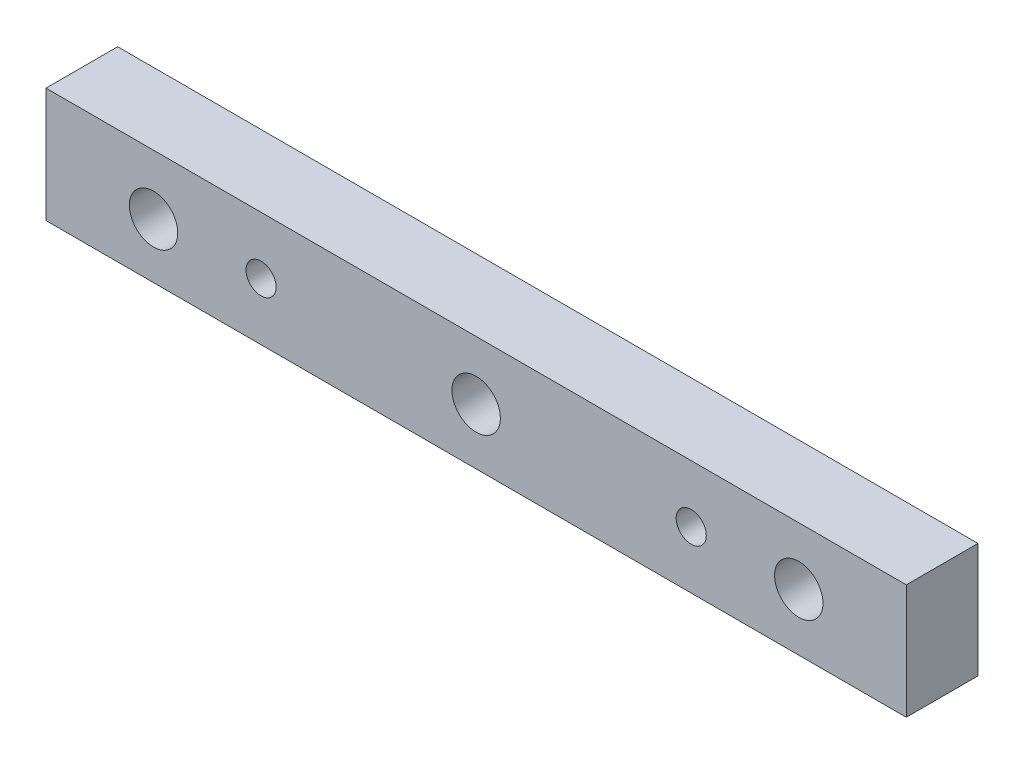
ISO-10303-21;
HEADER;
FILE_DESCRIPTION(('STEP AP214'),'2;1');
FILE_NAME('part.step','',(''),(''),'','','');
FILE_SCHEMA(('AUTOMOTIVE_DESIGN { 1 0 10303 214 1 1 1 1 }'));
ENDSEC;
DATA;
#1=APPLICATION_CONTEXT('core data for automotive mechanical design processes');
#2=APPLICATION_PROTOCOL_DEFINITION('international standard','automotive_design',2000,#1);
#3=PRODUCT_CONTEXT('',#1,'mechanical');
#4=PRODUCT('Part','Part','',(#3));
#5=PRODUCT_RELATED_PRODUCT_CATEGORY('part','',(#4));
#6=PRODUCT_DEFINITION_FORMATION('','',#4);
#7=PRODUCT_DEFINITION_CONTEXT('part definition',#1,'design');
#8=PRODUCT_DEFINITION('design','',#6,#7);
#9=PRODUCT_DEFINITION_SHAPE('','',#8);
#10=(LENGTH_UNIT() NAMED_UNIT(*) SI_UNIT(.MILLI.,.METRE.));
#11=(NAMED_UNIT(*) PLANE_ANGLE_UNIT() SI_UNIT($,.RADIAN.));
#12=(NAMED_UNIT(*) SI_UNIT($,.STERADIAN.) SOLID_ANGLE_UNIT());
#13=UNCERTAINTY_MEASURE_WITH_UNIT(LENGTH_MEASURE(1.E-05),#10,'distance_accuracy_value','');
#14=(GEOMETRIC_REPRESENTATION_CONTEXT(3) GLOBAL_UNCERTAINTY_ASSIGNED_CONTEXT((#13)) GLOBAL_UNIT_ASSIGNED_CONTEXT((#10,
#11,#12)) REPRESENTATION_CONTEXT('',''));
#15=CARTESIAN_POINT('',(0.,0.,0.));
#16=DIRECTION('',(0.,0.,1.));
#17=DIRECTION('',(1.,0.,0.));
#18=AXIS2_PLACEMENT_3D('',#15,#16,#17);
#19=CARTESIAN_POINT('',(-39.4695723684211,11.875,10.));
#20=DIRECTION('',(1.,0.,0.));
#21=DIRECTION('',(0.,0.,-1.));
#22=AXIS2_PLACEMENT_3D('',#19,#20,#21);
#23=PLANE('',#22);
#24=DIRECTION('',(0.,-1.,0.));
#25=VECTOR('',#24,1.);
#26=CARTESIAN_POINT('',(-39.4695723684211,11.875,0.));
#27=LINE('',#26,#25);
#28=CARTESIAN_POINT('',(-39.4695723684211,11.875,0.));
#29=VERTEX_POINT('',#28);
#30=CARTESIAN_POINT('',(-39.4695723684211,-4.125,0.));
#31=VERTEX_POINT('',#30);
#32=EDGE_CURVE('E101',#29,#31,#27,.T.);
#33=ORIENTED_EDGE('',*,*,#32,.T.);
#34=DIRECTION('',(0.,0.,-1.));
#35=VECTOR('',#34,1.);
#36=CARTESIAN_POINT('',(-39.4695723684211,-4.125,10.));
#37=LINE('',#36,#35);
#38=CARTESIAN_POINT('',(-39.4695723684211,-4.125,10.));
#39=VERTEX_POINT('',#38);
#40=EDGE_CURVE('E11',#39,#31,#37,.T.);
#41=ORIENTED_EDGE('',*,*,#40,.F.);
#42=DIRECTION('',(0.,-1.,0.));
#43=VECTOR('',#42,1.);
#44=CARTESIAN_POINT('',(-39.4695723684211,11.875,10.));
#45=LINE('',#44,#43);
#46=CARTESIAN_POINT('',(-39.4695723684211,11.875,10.));
#47=VERTEX_POINT('',#46);
#48=EDGE_CURVE('E89',#47,#39,#45,.T.);
#49=ORIENTED_EDGE('',*,*,#48,.F.);
#50=DIRECTION('',(0.,0.,-1.));
#51=VECTOR('',#50,1.);
#52=CARTESIAN_POINT('',(-39.4695723684211,11.875,10.));
#53=LINE('',#52,#51);
#54=EDGE_CURVE('E97',#47,#29,#53,.T.);
#55=ORIENTED_EDGE('',*,*,#54,.T.);
#56=EDGE_LOOP('',(#33,#41,#49,#55));
#57=FACE_BOUND('',#56,.T.);
#58=ADVANCED_FACE('F38',(#57),#23,.F.);
#59=CARTESIAN_POINT('',(-39.4695723684211,-4.125,10.));
#60=DIRECTION('',(0.,1.,0.));
#61=DIRECTION('',(0.,0.,1.));
#62=AXIS2_PLACEMENT_3D('',#59,#60,#61);
#63=PLANE('',#62);
#64=DIRECTION('',(1.,0.,0.));
#65=VECTOR('',#64,1.);
#66=CARTESIAN_POINT('',(-39.4695723684211,-4.125,0.));
#67=LINE('',#66,#65);
#68=CARTESIAN_POINT('',(80.5304276315789,-4.125,0.));
#69=VERTEX_POINT('',#68);
#70=EDGE_CURVE('E93',#31,#69,#67,.T.);
#71=ORIENTED_EDGE('',*,*,#70,.T.);
#72=DIRECTION('',(0.,0.,-1.));
#73=VECTOR('',#72,1.);
#74=CARTESIAN_POINT('',(80.5304276315789,-4.125,10.));
#75=LINE('',#74,#73);
#76=CARTESIAN_POINT('',(80.5304276315789,-4.125,10.));
#77=VERTEX_POINT('',#76);
#78=EDGE_CURVE('E46',#77,#69,#75,.T.);
#79=ORIENTED_EDGE('',*,*,#78,.F.);
#80=DIRECTION('',(1.,0.,0.));
#81=VECTOR('',#80,1.);
#82=CARTESIAN_POINT('',(-39.4695723684211,-4.125,10.));
#83=LINE('',#82,#81);
#84=EDGE_CURVE('E84',#39,#77,#83,.T.);
#85=ORIENTED_EDGE('',*,*,#84,.F.);
#86=ORIENTED_EDGE('',*,*,#40,.T.);
#87=EDGE_LOOP('',(#71,#79,#85,#86));
#88=FACE_BOUND('',#87,.T.);
#89=ADVANCED_FACE('F92',(#88),#63,.F.);
#90=CARTESIAN_POINT('',(80.5304276315789,11.875,10.));
#91=DIRECTION('',(-1.,0.,0.));
#92=DIRECTION('',(0.,0.,1.));
#93=AXIS2_PLACEMENT_3D('',#90,#91,#92);
#94=PLANE('',#93);
#95=DIRECTION('',(0.,1.,0.));
#96=VECTOR('',#95,1.);
#97=CARTESIAN_POINT('',(80.5304276315789,11.875,0.));
#98=LINE('',#97,#96);
#99=CARTESIAN_POINT('',(80.5304276315789,11.875,0.));
#100=VERTEX_POINT('',#99);
#101=EDGE_CURVE('E71',#69,#100,#98,.T.);
#102=ORIENTED_EDGE('',*,*,#101,.T.);
#103=DIRECTION('',(0.,0.,-1.));
#104=VECTOR('',#103,1.);
#105=CARTESIAN_POINT('',(80.5304276315789,11.875,10.));
#106=LINE('',#105,#104);
#107=CARTESIAN_POINT('',(80.5304276315789,11.875,10.));
#108=VERTEX_POINT('',#107);
#109=EDGE_CURVE('E94',#108,#100,#106,.T.);
#110=ORIENTED_EDGE('',*,*,#109,.F.);
#111=DIRECTION('',(0.,1.,0.));
#112=VECTOR('',#111,1.);
#113=CARTESIAN_POINT('',(80.5304276315789,11.875,10.));
#114=LINE('',#113,#112);
#115=EDGE_CURVE('E87',#77,#108,#114,.T.);
#116=ORIENTED_EDGE('',*,*,#115,.F.);
#117=ORIENTED_EDGE('',*,*,#78,.T.);
#118=EDGE_LOOP('',(#102,#110,#116,#117));
#119=FACE_BOUND('',#118,.T.);
#120=ADVANCED_FACE('F95',(#119),#94,.F.);
#121=CARTESIAN_POINT('',(-39.4695723684211,11.875,10.));
#122=DIRECTION('',(0.,-1.,0.));
#123=DIRECTION('',(0.,0.,-1.));
#124=AXIS2_PLACEMENT_3D('',#121,#122,#123);
#125=PLANE('',#124);
#126=DIRECTION('',(-1.,0.,0.));
#127=VECTOR('',#126,1.);
#128=CARTESIAN_POINT('',(-39.4695723684211,11.875,0.));
#129=LINE('',#128,#127);
#130=EDGE_CURVE('E77',#100,#29,#129,.T.);
#131=ORIENTED_EDGE('',*,*,#130,.T.);
#132=ORIENTED_EDGE('',*,*,#54,.F.);
#133=DIRECTION('',(-1.,0.,0.));
#134=VECTOR('',#133,1.);
#135=CARTESIAN_POINT('',(-39.4695723684211,11.875,10.));
#136=LINE('',#135,#134);
#137=EDGE_CURVE('E54',#108,#47,#136,.T.);
#138=ORIENTED_EDGE('',*,*,#137,.F.);
#139=ORIENTED_EDGE('',*,*,#109,.T.);
#140=EDGE_LOOP('',(#131,#132,#138,#139));
#141=FACE_BOUND('',#140,.T.);
#142=ADVANCED_FACE('F109',(#141),#125,.F.);
#143=CARTESIAN_POINT('',(0.,0.,10.));
#144=DIRECTION('',(0.,0.,1.));
#145=DIRECTION('',(1.,0.,0.));
#146=AXIS2_PLACEMENT_3D('',#143,#144,#145);
#147=PLANE('',#146);
#148=CARTESIAN_POINT('',(-24.4695723684211,3.55401842519762,10.));
#149=DIRECTION('',(0.,0.,1.));
#150=DIRECTION('',(1.,0.,0.));
#151=AXIS2_PLACEMENT_3D('',#148,#149,#150);
#152=CIRCLE('',#151,3.3782);
#153=CARTESIAN_POINT('',(-21.0913723684211,3.55401842519762,10.));
#154=VERTEX_POINT('',#153);
#155=EDGE_CURVE('E141',#154,#154,#152,.T.);
#156=ORIENTED_EDGE('',*,*,#155,.F.);
#157=EDGE_LOOP('',(#156));
#158=FACE_BOUND('',#157,.T.);
#159=CARTESIAN_POINT('',(20.5304276315789,3.69158195725579,10.));
#160=DIRECTION('',(0.,0.,1.));
#161=DIRECTION('',(1.,0.,0.));
#162=AXIS2_PLACEMENT_3D('',#159,#160,#161);
#163=CIRCLE('',#162,3.3782);
#164=CARTESIAN_POINT('',(23.9086276315789,3.69158195725579,10.));
#165=VERTEX_POINT('',#164);
#166=EDGE_CURVE('E135',#165,#165,#163,.T.);
#167=ORIENTED_EDGE('',*,*,#166,.F.);
#168=EDGE_LOOP('',(#167));
#169=FACE_BOUND('',#168,.T.);
#170=CARTESIAN_POINT('',(65.5304276315789,3.82914548931395,10.));
#171=DIRECTION('',(0.,0.,1.));
#172=DIRECTION('',(1.,0.,0.));
#173=AXIS2_PLACEMENT_3D('',#170,#171,#172);
#174=CIRCLE('',#173,3.3782);
#175=CARTESIAN_POINT('',(68.9086276315789,3.82914548931395,10.));
#176=VERTEX_POINT('',#175);
#177=EDGE_CURVE('E129',#176,#176,#174,.T.);
#178=ORIENTED_EDGE('',*,*,#177,.F.);
#179=EDGE_LOOP('',(#178));
#180=FACE_BOUND('',#179,.T.);
#181=CARTESIAN_POINT('',(-9.46957236842105,3.87499999999999,10.));
#182=DIRECTION('',(0.,0.,1.));
#183=DIRECTION('',(1.,0.,0.));
#184=AXIS2_PLACEMENT_3D('',#181,#182,#183);
#185=CIRCLE('',#184,2.1);
#186=CARTESIAN_POINT('',(-7.36957236842105,3.87499999999999,10.));
#187=VERTEX_POINT('',#186);
#188=EDGE_CURVE('E123',#187,#187,#185,.T.);
#189=ORIENTED_EDGE('',*,*,#188,.F.);
#190=EDGE_LOOP('',(#189));
#191=FACE_BOUND('',#190,.T.);
#192=CARTESIAN_POINT('',(50.5304276315789,3.87499999999999,10.));
#193=DIRECTION('',(0.,0.,1.));
#194=DIRECTION('',(1.,0.,0.));
#195=AXIS2_PLACEMENT_3D('',#192,#193,#194);
#196=CIRCLE('',#195,2.1);
#197=CARTESIAN_POINT('',(52.6304276315789,3.87499999999999,10.));
#198=VERTEX_POINT('',#197);
#199=EDGE_CURVE('E117',#198,#198,#196,.T.);
#200=ORIENTED_EDGE('',*,*,#199,.F.);
#201=EDGE_LOOP('',(#200));
#202=FACE_BOUND('',#201,.T.);
#203=ORIENTED_EDGE('',*,*,#48,.T.);
#204=ORIENTED_EDGE('',*,*,#84,.T.);
#205=ORIENTED_EDGE('',*,*,#115,.T.);
#206=ORIENTED_EDGE('',*,*,#137,.T.);
#207=EDGE_LOOP('',(#203,#204,#205,#206));
#208=FACE_BOUND('',#207,.T.);
#209=ADVANCED_FACE('F85',(#158,#169,#180,#191,#202,#208),#147,.T.);
#210=CARTESIAN_POINT('',(0.,0.,0.));
#211=DIRECTION('',(0.,0.,1.));
#212=DIRECTION('',(1.,0.,0.));
#213=AXIS2_PLACEMENT_3D('',#210,#211,#212);
#214=PLANE('',#213);
#215=CARTESIAN_POINT('',(-24.4695723684211,3.55401842519762,0.));
#216=DIRECTION('',(0.,0.,1.));
#217=DIRECTION('',(1.,0.,0.));
#218=AXIS2_PLACEMENT_3D('',#215,#216,#217);
#219=CIRCLE('',#218,3.3782);
#220=CARTESIAN_POINT('',(-21.0913723684211,3.55401842519762,0.));
#221=VERTEX_POINT('',#220);
#222=EDGE_CURVE('E138',#221,#221,#219,.T.);
#223=ORIENTED_EDGE('',*,*,#222,.T.);
#224=EDGE_LOOP('',(#223));
#225=FACE_BOUND('',#224,.T.);
#226=CARTESIAN_POINT('',(20.5304276315789,3.69158195725579,0.));
#227=DIRECTION('',(0.,0.,1.));
#228=DIRECTION('',(1.,0.,0.));
#229=AXIS2_PLACEMENT_3D('',#226,#227,#228);
#230=CIRCLE('',#229,3.3782);
#231=CARTESIAN_POINT('',(23.9086276315789,3.69158195725579,0.));
#232=VERTEX_POINT('',#231);
#233=EDGE_CURVE('E132',#232,#232,#230,.T.);
#234=ORIENTED_EDGE('',*,*,#233,.T.);
#235=EDGE_LOOP('',(#234));
#236=FACE_BOUND('',#235,.T.);
#237=CARTESIAN_POINT('',(65.5304276315789,3.82914548931395,0.));
#238=DIRECTION('',(0.,0.,1.));
#239=DIRECTION('',(1.,0.,0.));
#240=AXIS2_PLACEMENT_3D('',#237,#238,#239);
#241=CIRCLE('',#240,3.3782);
#242=CARTESIAN_POINT('',(68.9086276315789,3.82914548931395,0.));
#243=VERTEX_POINT('',#242);
#244=EDGE_CURVE('E126',#243,#243,#241,.T.);
#245=ORIENTED_EDGE('',*,*,#244,.T.);
#246=EDGE_LOOP('',(#245));
#247=FACE_BOUND('',#246,.T.);
#248=CARTESIAN_POINT('',(-9.46957236842105,3.87499999999999,0.));
#249=DIRECTION('',(0.,0.,1.));
#250=DIRECTION('',(1.,0.,0.));
#251=AXIS2_PLACEMENT_3D('',#248,#249,#250);
#252=CIRCLE('',#251,2.1);
#253=CARTESIAN_POINT('',(-7.36957236842105,3.87499999999999,0.));
#254=VERTEX_POINT('',#253);
#255=EDGE_CURVE('E120',#254,#254,#252,.T.);
#256=ORIENTED_EDGE('',*,*,#255,.T.);
#257=EDGE_LOOP('',(#256));
#258=FACE_BOUND('',#257,.T.);
#259=CARTESIAN_POINT('',(50.5304276315789,3.87499999999999,0.));
#260=DIRECTION('',(0.,0.,1.));
#261=DIRECTION('',(1.,0.,0.));
#262=AXIS2_PLACEMENT_3D('',#259,#260,#261);
#263=CIRCLE('',#262,2.1);
#264=CARTESIAN_POINT('',(52.6304276315789,3.87499999999999,0.));
#265=VERTEX_POINT('',#264);
#266=EDGE_CURVE('E104',#265,#265,#263,.T.);
#267=ORIENTED_EDGE('',*,*,#266,.T.);
#268=EDGE_LOOP('',(#267));
#269=FACE_BOUND('',#268,.T.);
#270=ORIENTED_EDGE('',*,*,#32,.F.);
#271=ORIENTED_EDGE('',*,*,#130,.F.);
#272=ORIENTED_EDGE('',*,*,#101,.F.);
#273=ORIENTED_EDGE('',*,*,#70,.F.);
#274=EDGE_LOOP('',(#270,#271,#272,#273));
#275=FACE_BOUND('',#274,.T.);
#276=ADVANCED_FACE('F112',(#225,#236,#247,#258,#269,#275),#214,.F.);
#277=CARTESIAN_POINT('',(50.5304276315789,3.87499999999999,10.));
#278=DIRECTION('',(0.,0.,1.));
#279=DIRECTION('',(1.,0.,0.));
#280=AXIS2_PLACEMENT_3D('',#277,#278,#279);
#281=CYLINDRICAL_SURFACE('',#280,2.1);
#282=ORIENTED_EDGE('',*,*,#266,.F.);
#283=EDGE_LOOP('',(#282));
#284=FACE_BOUND('',#283,.T.);
#285=ORIENTED_EDGE('',*,*,#199,.T.);
#286=EDGE_LOOP('',(#285));
#287=FACE_BOUND('',#286,.T.);
#288=ADVANCED_FACE('F158',(#284,#287),#281,.F.);
#289=CARTESIAN_POINT('',(-9.46957236842105,3.87499999999999,10.));
#290=DIRECTION('',(0.,0.,1.));
#291=DIRECTION('',(1.,0.,0.));
#292=AXIS2_PLACEMENT_3D('',#289,#290,#291);
#293=CYLINDRICAL_SURFACE('',#292,2.1);
#294=ORIENTED_EDGE('',*,*,#255,.F.);
#295=EDGE_LOOP('',(#294));
#296=FACE_BOUND('',#295,.T.);
#297=ORIENTED_EDGE('',*,*,#188,.T.);
#298=EDGE_LOOP('',(#297));
#299=FACE_BOUND('',#298,.T.);
#300=ADVANCED_FACE('F160',(#296,#299),#293,.F.);
#301=CARTESIAN_POINT('',(65.5304276315789,3.82914548931395,10.));
#302=DIRECTION('',(0.,0.,1.));
#303=DIRECTION('',(1.,0.,0.));
#304=AXIS2_PLACEMENT_3D('',#301,#302,#303);
#305=CYLINDRICAL_SURFACE('',#304,3.3782);
#306=ORIENTED_EDGE('',*,*,#244,.F.);
#307=EDGE_LOOP('',(#306));
#308=FACE_BOUND('',#307,.T.);
#309=ORIENTED_EDGE('',*,*,#177,.T.);
#310=EDGE_LOOP('',(#309));
#311=FACE_BOUND('',#310,.T.);
#312=ADVANCED_FACE('F167',(#308,#311),#305,.F.);
#313=CARTESIAN_POINT('',(20.5304276315789,3.69158195725579,10.));
#314=DIRECTION('',(0.,0.,1.));
#315=DIRECTION('',(1.,0.,0.));
#316=AXIS2_PLACEMENT_3D('',#313,#314,#315);
#317=CYLINDRICAL_SURFACE('',#316,3.3782);
#318=ORIENTED_EDGE('',*,*,#233,.F.);
#319=EDGE_LOOP('',(#318));
#320=FACE_BOUND('',#319,.T.);
#321=ORIENTED_EDGE('',*,*,#166,.T.);
#322=EDGE_LOOP('',(#321));
#323=FACE_BOUND('',#322,.T.);
#324=ADVANCED_FACE('F206',(#320,#323),#317,.F.);
#325=CARTESIAN_POINT('',(-24.4695723684211,3.55401842519762,10.));
#326=DIRECTION('',(0.,0.,1.));
#327=DIRECTION('',(1.,0.,0.));
#328=AXIS2_PLACEMENT_3D('',#325,#326,#327);
#329=CYLINDRICAL_SURFACE('',#328,3.3782);
#330=ORIENTED_EDGE('',*,*,#222,.F.);
#331=EDGE_LOOP('',(#330));
#332=FACE_BOUND('',#331,.T.);
#333=ORIENTED_EDGE('',*,*,#155,.T.);
#334=EDGE_LOOP('',(#333));
#335=FACE_BOUND('',#334,.T.);
#336=ADVANCED_FACE('F145',(#332,#335),#329,.F.);
#337=CLOSED_SHELL('',(#58,#89,#120,#142,#209,#276,#288,#300,#312,#324,#336));
#338=MANIFOLD_SOLID_BREP('B2',#337);
#339=ADVANCED_BREP_SHAPE_REPRESENTATION('',(#18,#338),#14);
#340=SHAPE_DEFINITION_REPRESENTATION(#9,#339);
ENDSEC;
END-ISO-10303-21;
